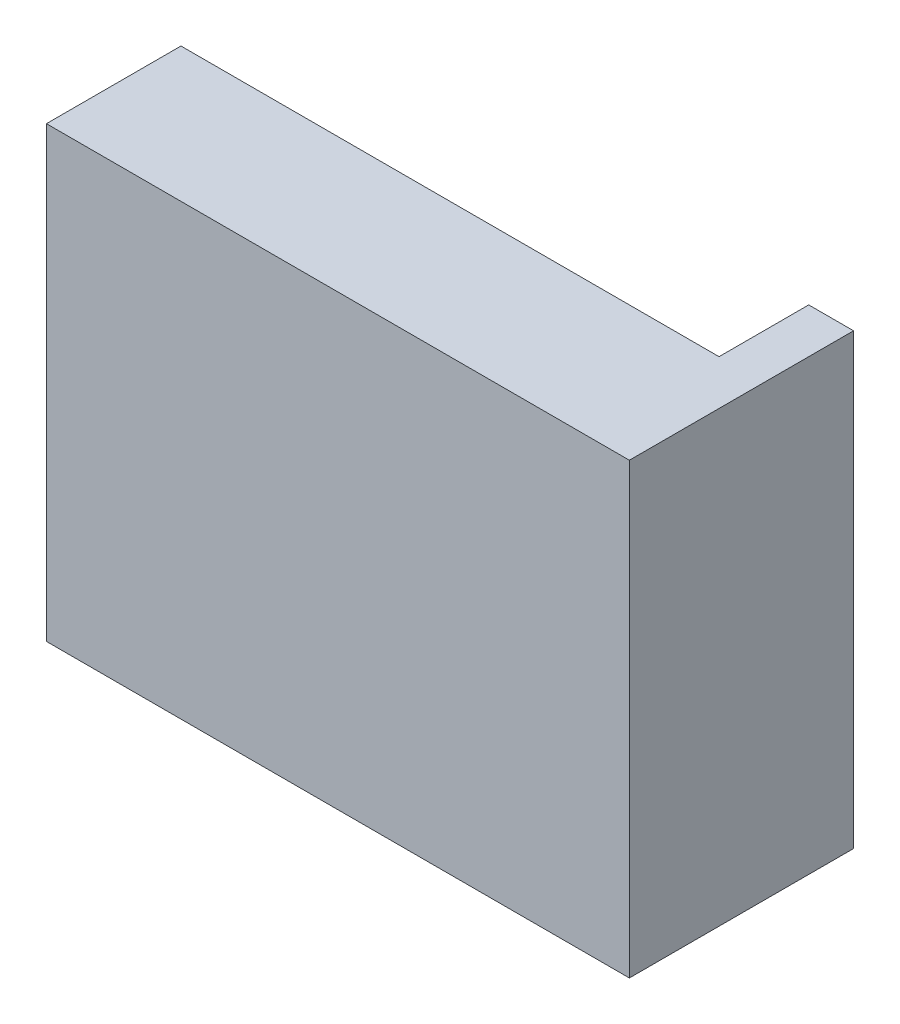
ISO-10303-21;
HEADER;
FILE_DESCRIPTION(('STEP AP214'),'2;1');
FILE_NAME('part.step','',(''),(''),'','','');
FILE_SCHEMA(('AUTOMOTIVE_DESIGN { 1 0 10303 214 1 1 1 1 }'));
ENDSEC;
DATA;
#1=APPLICATION_CONTEXT('core data for automotive mechanical design processes');
#2=APPLICATION_PROTOCOL_DEFINITION('international standard','automotive_design',2000,#1);
#3=PRODUCT_CONTEXT('',#1,'mechanical');
#4=PRODUCT('Part','Part','',(#3));
#5=PRODUCT_RELATED_PRODUCT_CATEGORY('part','',(#4));
#6=PRODUCT_DEFINITION_FORMATION('','',#4);
#7=PRODUCT_DEFINITION_CONTEXT('part definition',#1,'design');
#8=PRODUCT_DEFINITION('design','',#6,#7);
#9=PRODUCT_DEFINITION_SHAPE('','',#8);
#10=(LENGTH_UNIT() NAMED_UNIT(*) SI_UNIT(.MILLI.,.METRE.));
#11=(NAMED_UNIT(*) PLANE_ANGLE_UNIT() SI_UNIT($,.RADIAN.));
#12=(NAMED_UNIT(*) SI_UNIT($,.STERADIAN.) SOLID_ANGLE_UNIT());
#13=UNCERTAINTY_MEASURE_WITH_UNIT(LENGTH_MEASURE(1.E-05),#10,'distance_accuracy_value','');
#14=(GEOMETRIC_REPRESENTATION_CONTEXT(3) GLOBAL_UNCERTAINTY_ASSIGNED_CONTEXT((#13)) GLOBAL_UNIT_ASSIGNED_CONTEXT((#10,
#11,#12)) REPRESENTATION_CONTEXT('',''));
#15=CARTESIAN_POINT('',(0.,0.,0.));
#16=DIRECTION('',(0.,0.,1.));
#17=DIRECTION('',(1.,0.,0.));
#18=AXIS2_PLACEMENT_3D('',#15,#16,#17);
#19=CARTESIAN_POINT('',(0.,0.,0.));
#20=DIRECTION('',(0.,0.,1.));
#21=DIRECTION('',(1.,0.,0.));
#22=AXIS2_PLACEMENT_3D('',#19,#20,#21);
#23=PLANE('',#22);
#24=CARTESIAN_POINT('',(-5.,12.,0.));
#25=DIRECTION('',(0.,0.,-1.));
#26=DIRECTION('',(-1.,0.,0.));
#27=AXIS2_PLACEMENT_3D('',#24,#25,#26);
#28=CIRCLE('',#27,2.);
#29=CARTESIAN_POINT('',(-5.,14.,0.));
#30=VERTEX_POINT('',#29);
#31=CARTESIAN_POINT('',(-5.,10.,0.));
#32=VERTEX_POINT('',#31);
#33=EDGE_CURVE('E123',#30,#32,#28,.T.);
#34=ORIENTED_EDGE('',*,*,#33,.F.);
#35=DIRECTION('',(1.,0.,0.));
#36=VECTOR('',#35,1.);
#37=CARTESIAN_POINT('',(-5.,14.,0.));
#38=LINE('',#37,#36);
#39=CARTESIAN_POINT('',(-26.,14.,0.));
#40=VERTEX_POINT('',#39);
#41=EDGE_CURVE('E139',#40,#30,#38,.T.);
#42=ORIENTED_EDGE('',*,*,#41,.F.);
#43=DIRECTION('',(0.,-1.,0.));
#44=VECTOR('',#43,1.);
#45=CARTESIAN_POINT('',(-26.,0.,0.));
#46=LINE('',#45,#44);
#47=CARTESIAN_POINT('',(-26.,20.,0.));
#48=VERTEX_POINT('',#47);
#49=EDGE_CURVE('E205',#48,#40,#46,.T.);
#50=ORIENTED_EDGE('',*,*,#49,.F.);
#51=DIRECTION('',(-1.,0.,0.));
#52=VECTOR('',#51,1.);
#53=CARTESIAN_POINT('',(0.,20.,0.));
#54=LINE('',#53,#52);
#55=CARTESIAN_POINT('',(-2.,20.,0.));
#56=VERTEX_POINT('',#55);
#57=EDGE_CURVE('E186',#56,#48,#54,.T.);
#58=ORIENTED_EDGE('',*,*,#57,.F.);
#59=DIRECTION('',(0.,1.,0.));
#60=VECTOR('',#59,1.);
#61=CARTESIAN_POINT('',(-2.,0.,0.));
#62=LINE('',#61,#60);
#63=CARTESIAN_POINT('',(-2.,0.,0.));
#64=VERTEX_POINT('',#63);
#65=EDGE_CURVE('E63',#64,#56,#62,.T.);
#66=ORIENTED_EDGE('',*,*,#65,.F.);
#67=DIRECTION('',(1.,0.,0.));
#68=VECTOR('',#67,1.);
#69=CARTESIAN_POINT('',(0.,0.,0.));
#70=LINE('',#69,#68);
#71=CARTESIAN_POINT('',(-26.,0.,0.));
#72=VERTEX_POINT('',#71);
#73=EDGE_CURVE('E192',#72,#64,#70,.T.);
#74=ORIENTED_EDGE('',*,*,#73,.F.);
#75=CARTESIAN_POINT('',(-26.,10.,0.));
#76=VERTEX_POINT('',#75);
#77=EDGE_CURVE('E204',#76,#72,#46,.T.);
#78=ORIENTED_EDGE('',*,*,#77,.F.);
#79=DIRECTION('',(-1.,0.,0.));
#80=VECTOR('',#79,1.);
#81=CARTESIAN_POINT('',(-5.,10.,0.));
#82=LINE('',#81,#80);
#83=EDGE_CURVE('E143',#32,#76,#82,.T.);
#84=ORIENTED_EDGE('',*,*,#83,.F.);
#85=EDGE_LOOP('',(#34,#42,#50,#58,#66,#74,#78,#84));
#86=FACE_BOUND('',#85,.T.);
#87=ADVANCED_FACE('F39',(#86),#23,.F.);
#88=CARTESIAN_POINT('',(0.,0.,6.));
#89=DIRECTION('',(-1.,0.,0.));
#90=DIRECTION('',(0.,0.,1.));
#91=AXIS2_PLACEMENT_3D('',#88,#89,#90);
#92=PLANE('',#91);
#93=DIRECTION('',(0.,0.,-1.));
#94=VECTOR('',#93,1.);
#95=CARTESIAN_POINT('',(0.,0.,6.));
#96=LINE('',#95,#94);
#97=CARTESIAN_POINT('',(0.,0.,6.));
#98=VERTEX_POINT('',#97);
#99=CARTESIAN_POINT('',(0.,0.,-4.));
#100=VERTEX_POINT('',#99);
#101=EDGE_CURVE('E201',#98,#100,#96,.T.);
#102=ORIENTED_EDGE('',*,*,#101,.T.);
#103=DIRECTION('',(0.,-1.,0.));
#104=VECTOR('',#103,1.);
#105=CARTESIAN_POINT('',(0.,0.,-4.));
#106=LINE('',#105,#104);
#107=CARTESIAN_POINT('',(0.,20.,-4.));
#108=VERTEX_POINT('',#107);
#109=EDGE_CURVE('E162',#108,#100,#106,.T.);
#110=ORIENTED_EDGE('',*,*,#109,.F.);
#111=DIRECTION('',(0.,0.,-1.));
#112=VECTOR('',#111,1.);
#113=CARTESIAN_POINT('',(0.,20.,6.));
#114=LINE('',#113,#112);
#115=CARTESIAN_POINT('',(0.,20.,6.));
#116=VERTEX_POINT('',#115);
#117=EDGE_CURVE('E11',#116,#108,#114,.T.);
#118=ORIENTED_EDGE('',*,*,#117,.F.);
#119=DIRECTION('',(0.,1.,0.));
#120=VECTOR('',#119,1.);
#121=CARTESIAN_POINT('',(0.,0.,6.));
#122=LINE('',#121,#120);
#123=EDGE_CURVE('E187',#98,#116,#122,.T.);
#124=ORIENTED_EDGE('',*,*,#123,.F.);
#125=EDGE_LOOP('',(#102,#110,#118,#124));
#126=FACE_BOUND('',#125,.T.);
#127=ADVANCED_FACE('F41',(#126),#92,.F.);
#128=CARTESIAN_POINT('',(0.,20.,6.));
#129=DIRECTION('',(0.,-1.,0.));
#130=DIRECTION('',(1.,0.,0.));
#131=AXIS2_PLACEMENT_3D('',#128,#129,#130);
#132=PLANE('',#131);
#133=ORIENTED_EDGE('',*,*,#117,.T.);
#134=DIRECTION('',(1.,0.,0.));
#135=VECTOR('',#134,1.);
#136=CARTESIAN_POINT('',(0.,20.,-4.));
#137=LINE('',#136,#135);
#138=CARTESIAN_POINT('',(-2.,20.,-4.));
#139=VERTEX_POINT('',#138);
#140=EDGE_CURVE('E172',#139,#108,#137,.T.);
#141=ORIENTED_EDGE('',*,*,#140,.F.);
#142=DIRECTION('',(0.,0.,1.));
#143=VECTOR('',#142,1.);
#144=CARTESIAN_POINT('',(-2.,20.,-4.));
#145=LINE('',#144,#143);
#146=EDGE_CURVE('E176',#139,#56,#145,.T.);
#147=ORIENTED_EDGE('',*,*,#146,.T.);
#148=ORIENTED_EDGE('',*,*,#57,.T.);
#149=DIRECTION('',(0.,0.,-1.));
#150=VECTOR('',#149,1.);
#151=CARTESIAN_POINT('',(-26.,20.,6.));
#152=LINE('',#151,#150);
#153=CARTESIAN_POINT('',(-26.,20.,6.));
#154=VERTEX_POINT('',#153);
#155=EDGE_CURVE('E48',#154,#48,#152,.T.);
#156=ORIENTED_EDGE('',*,*,#155,.F.);
#157=DIRECTION('',(-1.,0.,0.));
#158=VECTOR('',#157,1.);
#159=CARTESIAN_POINT('',(0.,20.,6.));
#160=LINE('',#159,#158);
#161=EDGE_CURVE('E191',#116,#154,#160,.T.);
#162=ORIENTED_EDGE('',*,*,#161,.F.);
#163=EDGE_LOOP('',(#133,#141,#147,#148,#156,#162));
#164=FACE_BOUND('',#163,.T.);
#165=ADVANCED_FACE('F250',(#164),#132,.F.);
#166=CARTESIAN_POINT('',(-26.,0.,6.));
#167=DIRECTION('',(1.,0.,0.));
#168=DIRECTION('',(0.,0.,-1.));
#169=AXIS2_PLACEMENT_3D('',#166,#167,#168);
#170=PLANE('',#169);
#171=ORIENTED_EDGE('',*,*,#49,.T.);
#172=DIRECTION('',(0.,0.,-1.));
#173=VECTOR('',#172,1.);
#174=CARTESIAN_POINT('',(-26.,14.,2.));
#175=LINE('',#174,#173);
#176=CARTESIAN_POINT('',(-26.,14.,2.));
#177=VERTEX_POINT('',#176);
#178=EDGE_CURVE('E157',#177,#40,#175,.T.);
#179=ORIENTED_EDGE('',*,*,#178,.F.);
#180=DIRECTION('',(0.,1.,0.));
#181=VECTOR('',#180,1.);
#182=CARTESIAN_POINT('',(-26.,14.,2.));
#183=LINE('',#182,#181);
#184=CARTESIAN_POINT('',(-26.,10.,2.));
#185=VERTEX_POINT('',#184);
#186=EDGE_CURVE('E134',#185,#177,#183,.T.);
#187=ORIENTED_EDGE('',*,*,#186,.F.);
#188=DIRECTION('',(0.,0.,-1.));
#189=VECTOR('',#188,1.);
#190=CARTESIAN_POINT('',(-26.,10.,2.));
#191=LINE('',#190,#189);
#192=EDGE_CURVE('E127',#185,#76,#191,.T.);
#193=ORIENTED_EDGE('',*,*,#192,.T.);
#194=ORIENTED_EDGE('',*,*,#77,.T.);
#195=DIRECTION('',(0.,0.,-1.));
#196=VECTOR('',#195,1.);
#197=CARTESIAN_POINT('',(-26.,0.,6.));
#198=LINE('',#197,#196);
#199=CARTESIAN_POINT('',(-26.,0.,6.));
#200=VERTEX_POINT('',#199);
#201=EDGE_CURVE('E213',#200,#72,#198,.T.);
#202=ORIENTED_EDGE('',*,*,#201,.F.);
#203=DIRECTION('',(0.,-1.,0.));
#204=VECTOR('',#203,1.);
#205=CARTESIAN_POINT('',(-26.,0.,6.));
#206=LINE('',#205,#204);
#207=EDGE_CURVE('E195',#154,#200,#206,.T.);
#208=ORIENTED_EDGE('',*,*,#207,.F.);
#209=ORIENTED_EDGE('',*,*,#155,.T.);
#210=EDGE_LOOP('',(#171,#179,#187,#193,#194,#202,#208,#209));
#211=FACE_BOUND('',#210,.T.);
#212=ADVANCED_FACE('F222',(#211),#170,.F.);
#213=CARTESIAN_POINT('',(0.,0.,6.));
#214=DIRECTION('',(0.,1.,0.));
#215=DIRECTION('',(-1.,0.,0.));
#216=AXIS2_PLACEMENT_3D('',#213,#214,#215);
#217=PLANE('',#216);
#218=ORIENTED_EDGE('',*,*,#73,.T.);
#219=DIRECTION('',(0.,0.,1.));
#220=VECTOR('',#219,1.);
#221=CARTESIAN_POINT('',(-2.,0.,-4.));
#222=LINE('',#221,#220);
#223=CARTESIAN_POINT('',(-2.,0.,-4.));
#224=VERTEX_POINT('',#223);
#225=EDGE_CURVE('E182',#224,#64,#222,.T.);
#226=ORIENTED_EDGE('',*,*,#225,.F.);
#227=DIRECTION('',(-1.,0.,0.));
#228=VECTOR('',#227,1.);
#229=CARTESIAN_POINT('',(0.,0.,-4.));
#230=LINE('',#229,#228);
#231=EDGE_CURVE('E166',#100,#224,#230,.T.);
#232=ORIENTED_EDGE('',*,*,#231,.F.);
#233=ORIENTED_EDGE('',*,*,#101,.F.);
#234=DIRECTION('',(1.,0.,0.));
#235=VECTOR('',#234,1.);
#236=CARTESIAN_POINT('',(0.,0.,6.));
#237=LINE('',#236,#235);
#238=EDGE_CURVE('E198',#200,#98,#237,.T.);
#239=ORIENTED_EDGE('',*,*,#238,.F.);
#240=ORIENTED_EDGE('',*,*,#201,.T.);
#241=EDGE_LOOP('',(#218,#226,#232,#233,#239,#240));
#242=FACE_BOUND('',#241,.T.);
#243=ADVANCED_FACE('F233',(#242),#217,.F.);
#244=CARTESIAN_POINT('',(0.,0.,6.));
#245=DIRECTION('',(0.,0.,1.));
#246=DIRECTION('',(1.,0.,0.));
#247=AXIS2_PLACEMENT_3D('',#244,#245,#246);
#248=PLANE('',#247);
#249=ORIENTED_EDGE('',*,*,#123,.T.);
#250=ORIENTED_EDGE('',*,*,#161,.T.);
#251=ORIENTED_EDGE('',*,*,#207,.T.);
#252=ORIENTED_EDGE('',*,*,#238,.T.);
#253=EDGE_LOOP('',(#249,#250,#251,#252));
#254=FACE_BOUND('',#253,.T.);
#255=ADVANCED_FACE('F249',(#254),#248,.T.);
#256=CARTESIAN_POINT('',(-2.,0.,-4.));
#257=DIRECTION('',(1.,0.,0.));
#258=DIRECTION('',(0.,0.,-1.));
#259=AXIS2_PLACEMENT_3D('',#256,#257,#258);
#260=PLANE('',#259);
#261=ORIENTED_EDGE('',*,*,#65,.T.);
#262=ORIENTED_EDGE('',*,*,#146,.F.);
#263=DIRECTION('',(0.,1.,0.));
#264=VECTOR('',#263,1.);
#265=CARTESIAN_POINT('',(-2.,0.,-4.));
#266=LINE('',#265,#264);
#267=EDGE_CURVE('E169',#224,#139,#266,.T.);
#268=ORIENTED_EDGE('',*,*,#267,.F.);
#269=ORIENTED_EDGE('',*,*,#225,.T.);
#270=EDGE_LOOP('',(#261,#262,#268,#269));
#271=FACE_BOUND('',#270,.T.);
#272=ADVANCED_FACE('F238',(#271),#260,.F.);
#273=CARTESIAN_POINT('',(0.,0.,-4.));
#274=DIRECTION('',(0.,0.,1.));
#275=DIRECTION('',(1.,0.,0.));
#276=AXIS2_PLACEMENT_3D('',#273,#274,#275);
#277=PLANE('',#276);
#278=ORIENTED_EDGE('',*,*,#109,.T.);
#279=ORIENTED_EDGE('',*,*,#231,.T.);
#280=ORIENTED_EDGE('',*,*,#267,.T.);
#281=ORIENTED_EDGE('',*,*,#140,.T.);
#282=EDGE_LOOP('',(#278,#279,#280,#281));
#283=FACE_BOUND('',#282,.T.);
#284=ADVANCED_FACE('F242',(#283),#277,.F.);
#285=CARTESIAN_POINT('',(-5.,12.,2.));
#286=DIRECTION('',(0.,0.,-1.));
#287=DIRECTION('',(-1.,0.,0.));
#288=AXIS2_PLACEMENT_3D('',#285,#286,#287);
#289=CYLINDRICAL_SURFACE('',#288,2.);
#290=ORIENTED_EDGE('',*,*,#33,.T.);
#291=DIRECTION('',(0.,0.,-1.));
#292=VECTOR('',#291,1.);
#293=CARTESIAN_POINT('',(-5.,10.,2.));
#294=LINE('',#293,#292);
#295=CARTESIAN_POINT('',(-5.,10.,2.));
#296=VERTEX_POINT('',#295);
#297=EDGE_CURVE('E118',#296,#32,#294,.T.);
#298=ORIENTED_EDGE('',*,*,#297,.F.);
#299=CARTESIAN_POINT('',(-5.,12.,2.));
#300=DIRECTION('',(0.,0.,-1.));
#301=DIRECTION('',(-1.,0.,0.));
#302=AXIS2_PLACEMENT_3D('',#299,#300,#301);
#303=CIRCLE('',#302,2.);
#304=CARTESIAN_POINT('',(-5.,14.,2.));
#305=VERTEX_POINT('',#304);
#306=EDGE_CURVE('E120',#305,#296,#303,.T.);
#307=ORIENTED_EDGE('',*,*,#306,.F.);
#308=DIRECTION('',(0.,0.,-1.));
#309=VECTOR('',#308,1.);
#310=CARTESIAN_POINT('',(-5.,14.,2.));
#311=LINE('',#310,#309);
#312=EDGE_CURVE('E154',#305,#30,#311,.T.);
#313=ORIENTED_EDGE('',*,*,#312,.T.);
#314=EDGE_LOOP('',(#290,#298,#307,#313));
#315=FACE_BOUND('',#314,.T.);
#316=ADVANCED_FACE('F119',(#315),#289,.F.);
#317=CARTESIAN_POINT('',(-5.,14.,2.));
#318=DIRECTION('',(0.,1.,0.));
#319=DIRECTION('',(-1.,0.,0.));
#320=AXIS2_PLACEMENT_3D('',#317,#318,#319);
#321=PLANE('',#320);
#322=ORIENTED_EDGE('',*,*,#41,.T.);
#323=ORIENTED_EDGE('',*,*,#312,.F.);
#324=DIRECTION('',(1.,0.,0.));
#325=VECTOR('',#324,1.);
#326=CARTESIAN_POINT('',(-5.,14.,2.));
#327=LINE('',#326,#325);
#328=EDGE_CURVE('E128',#177,#305,#327,.T.);
#329=ORIENTED_EDGE('',*,*,#328,.F.);
#330=ORIENTED_EDGE('',*,*,#178,.T.);
#331=EDGE_LOOP('',(#322,#323,#329,#330));
#332=FACE_BOUND('',#331,.T.);
#333=ADVANCED_FACE('F228',(#332),#321,.F.);
#334=CARTESIAN_POINT('',(-5.,10.,2.));
#335=DIRECTION('',(0.,-1.,0.));
#336=DIRECTION('',(1.,0.,0.));
#337=AXIS2_PLACEMENT_3D('',#334,#335,#336);
#338=PLANE('',#337);
#339=ORIENTED_EDGE('',*,*,#83,.T.);
#340=ORIENTED_EDGE('',*,*,#192,.F.);
#341=DIRECTION('',(-1.,0.,0.));
#342=VECTOR('',#341,1.);
#343=CARTESIAN_POINT('',(-5.,10.,2.));
#344=LINE('',#343,#342);
#345=EDGE_CURVE('E55',#296,#185,#344,.T.);
#346=ORIENTED_EDGE('',*,*,#345,.F.);
#347=ORIENTED_EDGE('',*,*,#297,.T.);
#348=EDGE_LOOP('',(#339,#340,#346,#347));
#349=FACE_BOUND('',#348,.T.);
#350=ADVANCED_FACE('F130',(#349),#338,.F.);
#351=CARTESIAN_POINT('',(-5.,12.,2.));
#352=DIRECTION('',(0.,0.,-1.));
#353=DIRECTION('',(-1.,0.,0.));
#354=AXIS2_PLACEMENT_3D('',#351,#352,#353);
#355=PLANE('',#354);
#356=ORIENTED_EDGE('',*,*,#306,.T.);
#357=ORIENTED_EDGE('',*,*,#345,.T.);
#358=ORIENTED_EDGE('',*,*,#186,.T.);
#359=ORIENTED_EDGE('',*,*,#328,.T.);
#360=EDGE_LOOP('',(#356,#357,#358,#359));
#361=FACE_BOUND('',#360,.T.);
#362=ADVANCED_FACE('F136',(#361),#355,.T.);
#363=CLOSED_SHELL('',(#87,#127,#165,#212,#243,#255,#272,#284,#316,#333,#350,#362));
#364=MANIFOLD_SOLID_BREP('B2',#363);
#365=ADVANCED_BREP_SHAPE_REPRESENTATION('',(#18,#364),#14);
#366=SHAPE_DEFINITION_REPRESENTATION(#9,#365);
ENDSEC;
END-ISO-10303-21;
